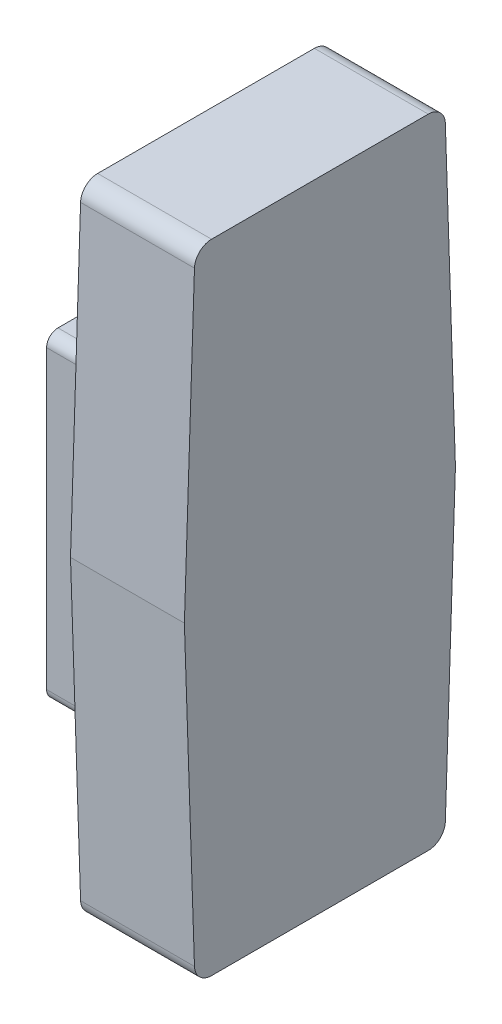
ISO-10303-21;
HEADER;
FILE_DESCRIPTION(('STEP AP214'),'2;1');
FILE_NAME('part.step','',(''),(''),'','','');
FILE_SCHEMA(('AUTOMOTIVE_DESIGN { 1 0 10303 214 1 1 1 1 }'));
ENDSEC;
DATA;
#1=APPLICATION_CONTEXT('core data for automotive mechanical design processes');
#2=APPLICATION_PROTOCOL_DEFINITION('international standard','automotive_design',2000,#1);
#3=PRODUCT_CONTEXT('',#1,'mechanical');
#4=PRODUCT('Part','Part','',(#3));
#5=PRODUCT_RELATED_PRODUCT_CATEGORY('part','',(#4));
#6=PRODUCT_DEFINITION_FORMATION('','',#4);
#7=PRODUCT_DEFINITION_CONTEXT('part definition',#1,'design');
#8=PRODUCT_DEFINITION('design','',#6,#7);
#9=PRODUCT_DEFINITION_SHAPE('','',#8);
#10=(LENGTH_UNIT() NAMED_UNIT(*) SI_UNIT(.MILLI.,.METRE.));
#11=(NAMED_UNIT(*) PLANE_ANGLE_UNIT() SI_UNIT($,.RADIAN.));
#12=(NAMED_UNIT(*) SI_UNIT($,.STERADIAN.) SOLID_ANGLE_UNIT());
#13=UNCERTAINTY_MEASURE_WITH_UNIT(LENGTH_MEASURE(1.E-05),#10,'distance_accuracy_value','');
#14=(GEOMETRIC_REPRESENTATION_CONTEXT(3) GLOBAL_UNCERTAINTY_ASSIGNED_CONTEXT((#13)) GLOBAL_UNIT_ASSIGNED_CONTEXT((#10,
#11,#12)) REPRESENTATION_CONTEXT('',''));
#15=CARTESIAN_POINT('',(0.,0.,0.));
#16=DIRECTION('',(0.,0.,1.));
#17=DIRECTION('',(1.,0.,0.));
#18=AXIS2_PLACEMENT_3D('',#15,#16,#17);
#19=CARTESIAN_POINT('',(0.,-13.462,0.));
#20=DIRECTION('',(1.,0.,0.));
#21=DIRECTION('',(0.,0.,-1.));
#22=AXIS2_PLACEMENT_3D('',#19,#20,#21);
#23=PLANE('',#22);
#24=CARTESIAN_POINT('',(0.,-13.462,0.));
#25=DIRECTION('',(1.,0.,0.));
#26=DIRECTION('',(0.,0.,-1.));
#27=AXIS2_PLACEMENT_3D('',#24,#25,#26);
#28=CIRCLE('',#27,0.381000000000001);
#29=CARTESIAN_POINT('',(0.,-13.843,0.));
#30=VERTEX_POINT('',#29);
#31=CARTESIAN_POINT('',(0.,-13.4746919372469,-0.380788543326764));
#32=VERTEX_POINT('',#31);
#33=EDGE_CURVE('E196',#30,#32,#28,.T.);
#34=ORIENTED_EDGE('',*,*,#33,.F.);
#35=DIRECTION('',(0.,0.,-1.));
#36=VECTOR('',#35,1.);
#37=CARTESIAN_POINT('',(0.,-13.843,4.83351517574958));
#38=LINE('',#37,#36);
#39=CARTESIAN_POINT('',(0.,-13.843,4.83351517574958));
#40=VERTEX_POINT('',#39);
#41=EDGE_CURVE('E212',#40,#30,#38,.T.);
#42=ORIENTED_EDGE('',*,*,#41,.F.);
#43=CARTESIAN_POINT('',(0.,-13.462,4.83351517574958));
#44=DIRECTION('',(1.,0.,0.));
#45=DIRECTION('',(0.,0.,-1.));
#46=AXIS2_PLACEMENT_3D('',#43,#44,#45);
#47=CIRCLE('',#46,0.381);
#48=CARTESIAN_POINT('',(0.,-13.4746919372469,5.21430371907635));
#49=VERTEX_POINT('',#48);
#50=EDGE_CURVE('E246',#49,#40,#47,.T.);
#51=ORIENTED_EDGE('',*,*,#50,.F.);
#52=DIRECTION('',(0.,-0.999444995608313,-0.0333121712516466));
#53=VECTOR('',#52,1.);
#54=CARTESIAN_POINT('',(0.,-6.731,5.43907548907775));
#55=LINE('',#54,#53);
#56=CARTESIAN_POINT('',(0.,-6.731,5.43907548907775));
#57=VERTEX_POINT('',#56);
#58=EDGE_CURVE('E243',#57,#49,#55,.T.);
#59=ORIENTED_EDGE('',*,*,#58,.F.);
#60=DIRECTION('',(0.,-0.999444995608313,0.0333121712516464));
#61=VECTOR('',#60,1.);
#62=CARTESIAN_POINT('',(0.,0.0126919372468769,5.21430371907635));
#63=LINE('',#62,#61);
#64=CARTESIAN_POINT('',(0.,0.0126919372468769,5.21430371907635));
#65=VERTEX_POINT('',#64);
#66=EDGE_CURVE('E241',#65,#57,#63,.T.);
#67=ORIENTED_EDGE('',*,*,#66,.F.);
#68=CARTESIAN_POINT('',(0.,0.,4.83351517574958));
#69=DIRECTION('',(1.,0.,0.));
#70=DIRECTION('',(0.,0.,-1.));
#71=AXIS2_PLACEMENT_3D('',#68,#69,#70);
#72=CIRCLE('',#71,0.381000000000001);
#73=CARTESIAN_POINT('',(0.,0.380999999999999,4.83351517574958));
#74=VERTEX_POINT('',#73);
#75=EDGE_CURVE('E239',#74,#65,#72,.T.);
#76=ORIENTED_EDGE('',*,*,#75,.F.);
#77=DIRECTION('',(0.,0.,1.));
#78=VECTOR('',#77,1.);
#79=CARTESIAN_POINT('',(0.,0.380999999999999,0.));
#80=LINE('',#79,#78);
#81=CARTESIAN_POINT('',(0.,0.381,0.));
#82=VERTEX_POINT('',#81);
#83=EDGE_CURVE('E237',#82,#74,#80,.T.);
#84=ORIENTED_EDGE('',*,*,#83,.F.);
#85=CARTESIAN_POINT('',(0.,0.,0.));
#86=DIRECTION('',(1.,0.,0.));
#87=DIRECTION('',(0.,0.,-1.));
#88=AXIS2_PLACEMENT_3D('',#85,#86,#87);
#89=CIRCLE('',#88,0.381);
#90=CARTESIAN_POINT('',(0.,0.0126919372468778,-0.380788543326767));
#91=VERTEX_POINT('',#90);
#92=EDGE_CURVE('E235',#91,#82,#89,.T.);
#93=ORIENTED_EDGE('',*,*,#92,.F.);
#94=DIRECTION('',(0.,0.999444995608313,0.0333121712516459));
#95=VECTOR('',#94,1.);
#96=CARTESIAN_POINT('',(0.,-6.731,-0.605560313328157));
#97=LINE('',#96,#95);
#98=CARTESIAN_POINT('',(0.,-6.731,-0.605560313328157));
#99=VERTEX_POINT('',#98);
#100=EDGE_CURVE('E233',#99,#91,#97,.T.);
#101=ORIENTED_EDGE('',*,*,#100,.F.);
#102=DIRECTION('',(0.,0.999444995608313,-0.0333121712516464));
#103=VECTOR('',#102,1.);
#104=CARTESIAN_POINT('',(0.,-13.4746919372469,-0.380788543326764));
#105=LINE('',#104,#103);
#106=EDGE_CURVE('E202',#32,#99,#105,.T.);
#107=ORIENTED_EDGE('',*,*,#106,.F.);
#108=EDGE_LOOP('',(#34,#42,#51,#59,#67,#76,#84,#93,#101,#107));
#109=FACE_BOUND('',#108,.T.);
#110=CARTESIAN_POINT('',(0.,-10.033,0.130757587874789));
#111=DIRECTION('',(-1.,0.,0.));
#112=DIRECTION('',(0.,0.,1.));
#113=AXIS2_PLACEMENT_3D('',#110,#111,#112);
#114=CIRCLE('',#113,0.254);
#115=CARTESIAN_POINT('',(0.,-10.033,-0.123242412125212));
#116=VERTEX_POINT('',#115);
#117=CARTESIAN_POINT('',(0.,-10.287,0.130757587874789));
#118=VERTEX_POINT('',#117);
#119=EDGE_CURVE('E194',#116,#118,#114,.T.);
#120=ORIENTED_EDGE('',*,*,#119,.F.);
#121=DIRECTION('',(0.,-1.,0.));
#122=VECTOR('',#121,1.);
#123=CARTESIAN_POINT('',(0.,-10.033,-0.123242412125212));
#124=LINE('',#123,#122);
#125=CARTESIAN_POINT('',(0.,-3.429,-0.123242412125213));
#126=VERTEX_POINT('',#125);
#127=EDGE_CURVE('E191',#126,#116,#124,.T.);
#128=ORIENTED_EDGE('',*,*,#127,.F.);
#129=CARTESIAN_POINT('',(0.,-3.429,0.130757587874788));
#130=DIRECTION('',(-1.,0.,0.));
#131=DIRECTION('',(0.,0.,1.));
#132=AXIS2_PLACEMENT_3D('',#129,#130,#131);
#133=CIRCLE('',#132,0.254000000000001);
#134=CARTESIAN_POINT('',(0.,-3.175,0.130757587874788));
#135=VERTEX_POINT('',#134);
#136=EDGE_CURVE('E593',#135,#126,#133,.T.);
#137=ORIENTED_EDGE('',*,*,#136,.F.);
#138=DIRECTION('',(0.,0.,-1.));
#139=VECTOR('',#138,1.);
#140=CARTESIAN_POINT('',(0.,-3.175,0.130757587874788));
#141=LINE('',#140,#139);
#142=CARTESIAN_POINT('',(0.,-3.175,4.70275758787479));
#143=VERTEX_POINT('',#142);
#144=EDGE_CURVE('E590',#143,#135,#141,.T.);
#145=ORIENTED_EDGE('',*,*,#144,.F.);
#146=CARTESIAN_POINT('',(0.,-3.429,4.70275758787479));
#147=DIRECTION('',(-1.,0.,0.));
#148=DIRECTION('',(0.,0.,-1.));
#149=AXIS2_PLACEMENT_3D('',#146,#147,#148);
#150=CIRCLE('',#149,0.254);
#151=CARTESIAN_POINT('',(0.,-3.429,4.95675758787479));
#152=VERTEX_POINT('',#151);
#153=EDGE_CURVE('E587',#152,#143,#150,.T.);
#154=ORIENTED_EDGE('',*,*,#153,.F.);
#155=DIRECTION('',(0.,1.,0.));
#156=VECTOR('',#155,1.);
#157=CARTESIAN_POINT('',(0.,-10.033,4.95675758787479));
#158=LINE('',#157,#156);
#159=CARTESIAN_POINT('',(0.,-10.033,4.95675758787479));
#160=VERTEX_POINT('',#159);
#161=EDGE_CURVE('E584',#160,#152,#158,.T.);
#162=ORIENTED_EDGE('',*,*,#161,.F.);
#163=CARTESIAN_POINT('',(0.,-10.033,4.70275758787479));
#164=DIRECTION('',(-1.,0.,0.));
#165=DIRECTION('',(0.,0.,1.));
#166=AXIS2_PLACEMENT_3D('',#163,#164,#165);
#167=CIRCLE('',#166,0.254);
#168=CARTESIAN_POINT('',(0.,-10.287,4.70275758787479));
#169=VERTEX_POINT('',#168);
#170=EDGE_CURVE('E62',#169,#160,#167,.T.);
#171=ORIENTED_EDGE('',*,*,#170,.F.);
#172=DIRECTION('',(0.,0.,1.));
#173=VECTOR('',#172,1.);
#174=CARTESIAN_POINT('',(0.,-10.287,0.130757587874789));
#175=LINE('',#174,#173);
#176=EDGE_CURVE('E57',#118,#169,#175,.T.);
#177=ORIENTED_EDGE('',*,*,#176,.F.);
#178=EDGE_LOOP('',(#120,#128,#137,#145,#154,#162,#171,#177));
#179=FACE_BOUND('',#178,.T.);
#180=ADVANCED_FACE('F38',(#109,#179),#23,.F.);
#181=CARTESIAN_POINT('',(2.54,-13.462,0.));
#182=DIRECTION('',(-1.,0.,0.));
#183=DIRECTION('',(0.,0.,1.));
#184=AXIS2_PLACEMENT_3D('',#181,#182,#183);
#185=CYLINDRICAL_SURFACE('',#184,0.381000000000001);
#186=ORIENTED_EDGE('',*,*,#33,.T.);
#187=DIRECTION('',(-1.,0.,0.));
#188=VECTOR('',#187,1.);
#189=CARTESIAN_POINT('',(2.54,-13.4746919372469,-0.380788543326764));
#190=LINE('',#189,#188);
#191=CARTESIAN_POINT('',(2.54,-13.4746919372469,-0.380788543326764));
#192=VERTEX_POINT('',#191);
#193=EDGE_CURVE('E11',#192,#32,#190,.T.);
#194=ORIENTED_EDGE('',*,*,#193,.F.);
#195=CARTESIAN_POINT('',(2.54,-13.462,0.));
#196=DIRECTION('',(1.,0.,0.));
#197=DIRECTION('',(0.,0.,-1.));
#198=AXIS2_PLACEMENT_3D('',#195,#196,#197);
#199=CIRCLE('',#198,0.381000000000001);
#200=CARTESIAN_POINT('',(2.54,-13.843,0.));
#201=VERTEX_POINT('',#200);
#202=EDGE_CURVE('E208',#201,#192,#199,.T.);
#203=ORIENTED_EDGE('',*,*,#202,.F.);
#204=DIRECTION('',(-1.,0.,0.));
#205=VECTOR('',#204,1.);
#206=CARTESIAN_POINT('',(2.54,-13.843,0.));
#207=LINE('',#206,#205);
#208=EDGE_CURVE('E230',#201,#30,#207,.T.);
#209=ORIENTED_EDGE('',*,*,#208,.T.);
#210=EDGE_LOOP('',(#186,#194,#203,#209));
#211=FACE_BOUND('',#210,.T.);
#212=ADVANCED_FACE('F40',(#211),#185,.T.);
#213=CARTESIAN_POINT('',(2.54,-13.4746919372469,-0.380788543326764));
#214=DIRECTION('',(0.,0.0333121712516464,0.999444995608313));
#215=DIRECTION('',(0.,-0.999444995608313,0.0333121712516464));
#216=AXIS2_PLACEMENT_3D('',#213,#214,#215);
#217=PLANE('',#216);
#218=ORIENTED_EDGE('',*,*,#106,.T.);
#219=DIRECTION('',(-1.,0.,0.));
#220=VECTOR('',#219,1.);
#221=CARTESIAN_POINT('',(2.54,-6.731,-0.605560313328157));
#222=LINE('',#221,#220);
#223=CARTESIAN_POINT('',(2.54,-6.731,-0.605560313328157));
#224=VERTEX_POINT('',#223);
#225=EDGE_CURVE('E47',#224,#99,#222,.T.);
#226=ORIENTED_EDGE('',*,*,#225,.F.);
#227=DIRECTION('',(0.,0.999444995608313,-0.0333121712516464));
#228=VECTOR('',#227,1.);
#229=CARTESIAN_POINT('',(2.54,-13.4746919372469,-0.380788543326764));
#230=LINE('',#229,#228);
#231=EDGE_CURVE('E211',#192,#224,#230,.T.);
#232=ORIENTED_EDGE('',*,*,#231,.F.);
#233=ORIENTED_EDGE('',*,*,#193,.T.);
#234=EDGE_LOOP('',(#218,#226,#232,#233));
#235=FACE_BOUND('',#234,.T.);
#236=ADVANCED_FACE('F303',(#235),#217,.F.);
#237=CARTESIAN_POINT('',(2.54,-6.731,-0.605560313328157));
#238=DIRECTION('',(0.,-0.0333121712516459,0.999444995608313));
#239=DIRECTION('',(0.,-0.999444995608313,-0.0333121712516459));
#240=AXIS2_PLACEMENT_3D('',#237,#238,#239);
#241=PLANE('',#240);
#242=ORIENTED_EDGE('',*,*,#100,.T.);
#243=DIRECTION('',(-1.,0.,0.));
#244=VECTOR('',#243,1.);
#245=CARTESIAN_POINT('',(2.54,0.0126919372468778,-0.380788543326767));
#246=LINE('',#245,#244);
#247=CARTESIAN_POINT('',(2.54,0.0126919372468778,-0.380788543326767));
#248=VERTEX_POINT('',#247);
#249=EDGE_CURVE('E274',#248,#91,#246,.T.);
#250=ORIENTED_EDGE('',*,*,#249,.F.);
#251=DIRECTION('',(0.,0.999444995608313,0.0333121712516459));
#252=VECTOR('',#251,1.);
#253=CARTESIAN_POINT('',(2.54,-6.731,-0.605560313328157));
#254=LINE('',#253,#252);
#255=EDGE_CURVE('E215',#224,#248,#254,.T.);
#256=ORIENTED_EDGE('',*,*,#255,.F.);
#257=ORIENTED_EDGE('',*,*,#225,.T.);
#258=EDGE_LOOP('',(#242,#250,#256,#257));
#259=FACE_BOUND('',#258,.T.);
#260=ADVANCED_FACE('F281',(#259),#241,.F.);
#261=CARTESIAN_POINT('',(2.54,0.,0.));
#262=DIRECTION('',(-1.,0.,0.));
#263=DIRECTION('',(0.,0.,1.));
#264=AXIS2_PLACEMENT_3D('',#261,#262,#263);
#265=CYLINDRICAL_SURFACE('',#264,0.381);
#266=ORIENTED_EDGE('',*,*,#92,.T.);
#267=DIRECTION('',(-1.,0.,0.));
#268=VECTOR('',#267,1.);
#269=CARTESIAN_POINT('',(2.54,0.381,0.));
#270=LINE('',#269,#268);
#271=CARTESIAN_POINT('',(2.54,0.381,0.));
#272=VERTEX_POINT('',#271);
#273=EDGE_CURVE('E271',#272,#82,#270,.T.);
#274=ORIENTED_EDGE('',*,*,#273,.F.);
#275=CARTESIAN_POINT('',(2.54,0.,0.));
#276=DIRECTION('',(1.,0.,0.));
#277=DIRECTION('',(0.,0.,-1.));
#278=AXIS2_PLACEMENT_3D('',#275,#276,#277);
#279=CIRCLE('',#278,0.381);
#280=EDGE_CURVE('E217',#248,#272,#279,.T.);
#281=ORIENTED_EDGE('',*,*,#280,.F.);
#282=ORIENTED_EDGE('',*,*,#249,.T.);
#283=EDGE_LOOP('',(#266,#274,#281,#282));
#284=FACE_BOUND('',#283,.T.);
#285=ADVANCED_FACE('F291',(#284),#265,.T.);
#286=CARTESIAN_POINT('',(2.54,0.380999999999999,0.));
#287=DIRECTION('',(0.,-1.,0.));
#288=DIRECTION('',(0.,0.,-1.));
#289=AXIS2_PLACEMENT_3D('',#286,#287,#288);
#290=PLANE('',#289);
#291=ORIENTED_EDGE('',*,*,#83,.T.);
#292=DIRECTION('',(-1.,0.,0.));
#293=VECTOR('',#292,1.);
#294=CARTESIAN_POINT('',(2.54,0.380999999999999,4.83351517574958));
#295=LINE('',#294,#293);
#296=CARTESIAN_POINT('',(2.54,0.380999999999999,4.83351517574958));
#297=VERTEX_POINT('',#296);
#298=EDGE_CURVE('E268',#297,#74,#295,.T.);
#299=ORIENTED_EDGE('',*,*,#298,.F.);
#300=DIRECTION('',(0.,0.,1.));
#301=VECTOR('',#300,1.);
#302=CARTESIAN_POINT('',(2.54,0.380999999999999,0.));
#303=LINE('',#302,#301);
#304=EDGE_CURVE('E219',#272,#297,#303,.T.);
#305=ORIENTED_EDGE('',*,*,#304,.F.);
#306=ORIENTED_EDGE('',*,*,#273,.T.);
#307=EDGE_LOOP('',(#291,#299,#305,#306));
#308=FACE_BOUND('',#307,.T.);
#309=ADVANCED_FACE('F295',(#308),#290,.F.);
#310=CARTESIAN_POINT('',(2.54,0.,4.83351517574958));
#311=DIRECTION('',(-1.,0.,0.));
#312=DIRECTION('',(0.,0.,1.));
#313=AXIS2_PLACEMENT_3D('',#310,#311,#312);
#314=CYLINDRICAL_SURFACE('',#313,0.381000000000001);
#315=ORIENTED_EDGE('',*,*,#75,.T.);
#316=DIRECTION('',(-1.,0.,0.));
#317=VECTOR('',#316,1.);
#318=CARTESIAN_POINT('',(2.54,0.0126919372468769,5.21430371907635));
#319=LINE('',#318,#317);
#320=CARTESIAN_POINT('',(2.54,0.0126919372468769,5.21430371907635));
#321=VERTEX_POINT('',#320);
#322=EDGE_CURVE('E265',#321,#65,#319,.T.);
#323=ORIENTED_EDGE('',*,*,#322,.F.);
#324=CARTESIAN_POINT('',(2.54,0.,4.83351517574958));
#325=DIRECTION('',(1.,0.,0.));
#326=DIRECTION('',(0.,0.,-1.));
#327=AXIS2_PLACEMENT_3D('',#324,#325,#326);
#328=CIRCLE('',#327,0.381000000000001);
#329=EDGE_CURVE('E221',#297,#321,#328,.T.);
#330=ORIENTED_EDGE('',*,*,#329,.F.);
#331=ORIENTED_EDGE('',*,*,#298,.T.);
#332=EDGE_LOOP('',(#315,#323,#330,#331));
#333=FACE_BOUND('',#332,.T.);
#334=ADVANCED_FACE('F326',(#333),#314,.T.);
#335=CARTESIAN_POINT('',(2.54,0.0126919372468769,5.21430371907635));
#336=DIRECTION('',(0.,-0.0333121712516464,-0.999444995608313));
#337=DIRECTION('',(0.,0.999444995608313,-0.0333121712516464));
#338=AXIS2_PLACEMENT_3D('',#335,#336,#337);
#339=PLANE('',#338);
#340=ORIENTED_EDGE('',*,*,#66,.T.);
#341=DIRECTION('',(-1.,0.,0.));
#342=VECTOR('',#341,1.);
#343=CARTESIAN_POINT('',(2.54,-6.731,5.43907548907775));
#344=LINE('',#343,#342);
#345=CARTESIAN_POINT('',(2.54,-6.731,5.43907548907775));
#346=VERTEX_POINT('',#345);
#347=EDGE_CURVE('E262',#346,#57,#344,.T.);
#348=ORIENTED_EDGE('',*,*,#347,.F.);
#349=DIRECTION('',(0.,-0.999444995608313,0.0333121712516464));
#350=VECTOR('',#349,1.);
#351=CARTESIAN_POINT('',(2.54,0.0126919372468769,5.21430371907635));
#352=LINE('',#351,#350);
#353=EDGE_CURVE('E223',#321,#346,#352,.T.);
#354=ORIENTED_EDGE('',*,*,#353,.F.);
#355=ORIENTED_EDGE('',*,*,#322,.T.);
#356=EDGE_LOOP('',(#340,#348,#354,#355));
#357=FACE_BOUND('',#356,.T.);
#358=ADVANCED_FACE('F323',(#357),#339,.F.);
#359=CARTESIAN_POINT('',(2.54,-6.731,5.43907548907775));
#360=DIRECTION('',(0.,0.0333121712516466,-0.999444995608313));
#361=DIRECTION('',(0.,0.999444995608313,0.0333121712516466));
#362=AXIS2_PLACEMENT_3D('',#359,#360,#361);
#363=PLANE('',#362);
#364=ORIENTED_EDGE('',*,*,#58,.T.);
#365=DIRECTION('',(-1.,0.,0.));
#366=VECTOR('',#365,1.);
#367=CARTESIAN_POINT('',(2.54,-13.4746919372469,5.21430371907635));
#368=LINE('',#367,#366);
#369=CARTESIAN_POINT('',(2.54,-13.4746919372469,5.21430371907635));
#370=VERTEX_POINT('',#369);
#371=EDGE_CURVE('E258',#370,#49,#368,.T.);
#372=ORIENTED_EDGE('',*,*,#371,.F.);
#373=DIRECTION('',(0.,-0.999444995608313,-0.0333121712516466));
#374=VECTOR('',#373,1.);
#375=CARTESIAN_POINT('',(2.54,-6.731,5.43907548907775));
#376=LINE('',#375,#374);
#377=EDGE_CURVE('E225',#346,#370,#376,.T.);
#378=ORIENTED_EDGE('',*,*,#377,.F.);
#379=ORIENTED_EDGE('',*,*,#347,.T.);
#380=EDGE_LOOP('',(#364,#372,#378,#379));
#381=FACE_BOUND('',#380,.T.);
#382=ADVANCED_FACE('F319',(#381),#363,.F.);
#383=CARTESIAN_POINT('',(2.54,-13.462,4.83351517574958));
#384=DIRECTION('',(-1.,0.,0.));
#385=DIRECTION('',(0.,0.,1.));
#386=AXIS2_PLACEMENT_3D('',#383,#384,#385);
#387=CYLINDRICAL_SURFACE('',#386,0.381);
#388=ORIENTED_EDGE('',*,*,#50,.T.);
#389=DIRECTION('',(-1.,0.,0.));
#390=VECTOR('',#389,1.);
#391=CARTESIAN_POINT('',(2.54,-13.843,4.83351517574958));
#392=LINE('',#391,#390);
#393=CARTESIAN_POINT('',(2.54,-13.843,4.83351517574958));
#394=VERTEX_POINT('',#393);
#395=EDGE_CURVE('E254',#394,#40,#392,.T.);
#396=ORIENTED_EDGE('',*,*,#395,.F.);
#397=CARTESIAN_POINT('',(2.54,-13.462,4.83351517574958));
#398=DIRECTION('',(1.,0.,0.));
#399=DIRECTION('',(0.,0.,-1.));
#400=AXIS2_PLACEMENT_3D('',#397,#398,#399);
#401=CIRCLE('',#400,0.381);
#402=EDGE_CURVE('E227',#370,#394,#401,.T.);
#403=ORIENTED_EDGE('',*,*,#402,.F.);
#404=ORIENTED_EDGE('',*,*,#371,.T.);
#405=EDGE_LOOP('',(#388,#396,#403,#404));
#406=FACE_BOUND('',#405,.T.);
#407=ADVANCED_FACE('F315',(#406),#387,.T.);
#408=CARTESIAN_POINT('',(2.54,-13.843,4.83351517574958));
#409=DIRECTION('',(0.,1.,0.));
#410=DIRECTION('',(0.,0.,1.));
#411=AXIS2_PLACEMENT_3D('',#408,#409,#410);
#412=PLANE('',#411);
#413=ORIENTED_EDGE('',*,*,#41,.T.);
#414=ORIENTED_EDGE('',*,*,#208,.F.);
#415=DIRECTION('',(0.,0.,-1.));
#416=VECTOR('',#415,1.);
#417=CARTESIAN_POINT('',(2.54,-13.843,4.83351517574958));
#418=LINE('',#417,#416);
#419=EDGE_CURVE('E229',#394,#201,#418,.T.);
#420=ORIENTED_EDGE('',*,*,#419,.F.);
#421=ORIENTED_EDGE('',*,*,#395,.T.);
#422=EDGE_LOOP('',(#413,#414,#420,#421));
#423=FACE_BOUND('',#422,.T.);
#424=ADVANCED_FACE('F310',(#423),#412,.F.);
#425=CARTESIAN_POINT('',(2.54,-13.462,0.));
#426=DIRECTION('',(1.,0.,0.));
#427=DIRECTION('',(0.,0.,-1.));
#428=AXIS2_PLACEMENT_3D('',#425,#426,#427);
#429=PLANE('',#428);
#430=ORIENTED_EDGE('',*,*,#202,.T.);
#431=ORIENTED_EDGE('',*,*,#231,.T.);
#432=ORIENTED_EDGE('',*,*,#255,.T.);
#433=ORIENTED_EDGE('',*,*,#280,.T.);
#434=ORIENTED_EDGE('',*,*,#304,.T.);
#435=ORIENTED_EDGE('',*,*,#329,.T.);
#436=ORIENTED_EDGE('',*,*,#353,.T.);
#437=ORIENTED_EDGE('',*,*,#377,.T.);
#438=ORIENTED_EDGE('',*,*,#402,.T.);
#439=ORIENTED_EDGE('',*,*,#419,.T.);
#440=EDGE_LOOP('',(#430,#431,#432,#433,#434,#435,#436,#437,#438,#439));
#441=FACE_BOUND('',#440,.T.);
#442=ADVANCED_FACE('F299',(#441),#429,.T.);
#443=CARTESIAN_POINT('',(-1.016,-10.033,0.130757587874789));
#444=DIRECTION('',(1.,0.,0.));
#445=DIRECTION('',(0.,0.,-1.));
#446=AXIS2_PLACEMENT_3D('',#443,#444,#445);
#447=CYLINDRICAL_SURFACE('',#446,0.254);
#448=ORIENTED_EDGE('',*,*,#119,.T.);
#449=DIRECTION('',(1.,0.,0.));
#450=VECTOR('',#449,1.);
#451=CARTESIAN_POINT('',(-1.016,-10.287,0.130757587874789));
#452=LINE('',#451,#450);
#453=CARTESIAN_POINT('',(-1.016,-10.287,0.130757587874789));
#454=VERTEX_POINT('',#453);
#455=EDGE_CURVE('E173',#454,#118,#452,.T.);
#456=ORIENTED_EDGE('',*,*,#455,.F.);
#457=CARTESIAN_POINT('',(-1.016,-10.033,0.130757587874789));
#458=DIRECTION('',(-1.,0.,0.));
#459=DIRECTION('',(0.,0.,1.));
#460=AXIS2_PLACEMENT_3D('',#457,#458,#459);
#461=CIRCLE('',#460,0.254);
#462=CARTESIAN_POINT('',(-1.016,-10.033,-0.123242412125212));
#463=VERTEX_POINT('',#462);
#464=EDGE_CURVE('E181',#463,#454,#461,.T.);
#465=ORIENTED_EDGE('',*,*,#464,.F.);
#466=DIRECTION('',(1.,0.,0.));
#467=VECTOR('',#466,1.);
#468=CARTESIAN_POINT('',(-1.016,-10.033,-0.123242412125212));
#469=LINE('',#468,#467);
#470=EDGE_CURVE('E579',#463,#116,#469,.T.);
#471=ORIENTED_EDGE('',*,*,#470,.T.);
#472=EDGE_LOOP('',(#448,#456,#465,#471));
#473=FACE_BOUND('',#472,.T.);
#474=ADVANCED_FACE('F193',(#473),#447,.T.);
#475=CARTESIAN_POINT('',(-1.016,-10.287,0.130757587874789));
#476=DIRECTION('',(0.,1.,0.));
#477=DIRECTION('',(0.,0.,1.));
#478=AXIS2_PLACEMENT_3D('',#475,#476,#477);
#479=PLANE('',#478);
#480=ORIENTED_EDGE('',*,*,#176,.T.);
#481=DIRECTION('',(1.,0.,0.));
#482=VECTOR('',#481,1.);
#483=CARTESIAN_POINT('',(-1.016,-10.287,4.70275758787479));
#484=LINE('',#483,#482);
#485=CARTESIAN_POINT('',(-1.016,-10.287,4.70275758787479));
#486=VERTEX_POINT('',#485);
#487=EDGE_CURVE('E176',#486,#169,#484,.T.);
#488=ORIENTED_EDGE('',*,*,#487,.F.);
#489=DIRECTION('',(0.,0.,1.));
#490=VECTOR('',#489,1.);
#491=CARTESIAN_POINT('',(-1.016,-10.287,0.130757587874789));
#492=LINE('',#491,#490);
#493=EDGE_CURVE('E169',#454,#486,#492,.T.);
#494=ORIENTED_EDGE('',*,*,#493,.F.);
#495=ORIENTED_EDGE('',*,*,#455,.T.);
#496=EDGE_LOOP('',(#480,#488,#494,#495));
#497=FACE_BOUND('',#496,.T.);
#498=ADVANCED_FACE('F171',(#497),#479,.F.);
#499=CARTESIAN_POINT('',(-1.016,-10.033,4.70275758787479));
#500=DIRECTION('',(1.,0.,0.));
#501=DIRECTION('',(0.,0.,-1.));
#502=AXIS2_PLACEMENT_3D('',#499,#500,#501);
#503=CYLINDRICAL_SURFACE('',#502,0.254);
#504=ORIENTED_EDGE('',*,*,#170,.T.);
#505=DIRECTION('',(1.,0.,0.));
#506=VECTOR('',#505,1.);
#507=CARTESIAN_POINT('',(-1.016,-10.033,4.95675758787479));
#508=LINE('',#507,#506);
#509=CARTESIAN_POINT('',(-1.016,-10.033,4.95675758787479));
#510=VERTEX_POINT('',#509);
#511=EDGE_CURVE('E204',#510,#160,#508,.T.);
#512=ORIENTED_EDGE('',*,*,#511,.F.);
#513=CARTESIAN_POINT('',(-1.016,-10.033,4.70275758787479));
#514=DIRECTION('',(-1.,0.,0.));
#515=DIRECTION('',(0.,0.,1.));
#516=AXIS2_PLACEMENT_3D('',#513,#514,#515);
#517=CIRCLE('',#516,0.254);
#518=EDGE_CURVE('E180',#486,#510,#517,.T.);
#519=ORIENTED_EDGE('',*,*,#518,.F.);
#520=ORIENTED_EDGE('',*,*,#487,.T.);
#521=EDGE_LOOP('',(#504,#512,#519,#520));
#522=FACE_BOUND('',#521,.T.);
#523=ADVANCED_FACE('F379',(#522),#503,.T.);
#524=CARTESIAN_POINT('',(-1.016,-10.033,4.95675758787479));
#525=DIRECTION('',(0.,0.,-1.));
#526=DIRECTION('',(-1.,0.,0.));
#527=AXIS2_PLACEMENT_3D('',#524,#525,#526);
#528=PLANE('',#527);
#529=ORIENTED_EDGE('',*,*,#161,.T.);
#530=DIRECTION('',(1.,0.,0.));
#531=VECTOR('',#530,1.);
#532=CARTESIAN_POINT('',(-1.016,-3.429,4.95675758787479));
#533=LINE('',#532,#531);
#534=CARTESIAN_POINT('',(-1.016,-3.429,4.95675758787479));
#535=VERTEX_POINT('',#534);
#536=EDGE_CURVE('E610',#535,#152,#533,.T.);
#537=ORIENTED_EDGE('',*,*,#536,.F.);
#538=DIRECTION('',(0.,1.,0.));
#539=VECTOR('',#538,1.);
#540=CARTESIAN_POINT('',(-1.016,-10.033,4.95675758787479));
#541=LINE('',#540,#539);
#542=EDGE_CURVE('E569',#510,#535,#541,.T.);
#543=ORIENTED_EDGE('',*,*,#542,.F.);
#544=ORIENTED_EDGE('',*,*,#511,.T.);
#545=EDGE_LOOP('',(#529,#537,#543,#544));
#546=FACE_BOUND('',#545,.T.);
#547=ADVANCED_FACE('F386',(#546),#528,.F.);
#548=CARTESIAN_POINT('',(-1.016,-3.429,4.70275758787479));
#549=DIRECTION('',(1.,0.,0.));
#550=DIRECTION('',(0.,0.,-1.));
#551=AXIS2_PLACEMENT_3D('',#548,#549,#550);
#552=CYLINDRICAL_SURFACE('',#551,0.254);
#553=ORIENTED_EDGE('',*,*,#153,.T.);
#554=DIRECTION('',(1.,0.,0.));
#555=VECTOR('',#554,1.);
#556=CARTESIAN_POINT('',(-1.016,-3.175,4.70275758787479));
#557=LINE('',#556,#555);
#558=CARTESIAN_POINT('',(-1.016,-3.175,4.70275758787479));
#559=VERTEX_POINT('',#558);
#560=EDGE_CURVE('E607',#559,#143,#557,.T.);
#561=ORIENTED_EDGE('',*,*,#560,.F.);
#562=CARTESIAN_POINT('',(-1.016,-3.429,4.70275758787479));
#563=DIRECTION('',(-1.,0.,0.));
#564=DIRECTION('',(0.,0.,-1.));
#565=AXIS2_PLACEMENT_3D('',#562,#563,#564);
#566=CIRCLE('',#565,0.254);
#567=EDGE_CURVE('E571',#535,#559,#566,.T.);
#568=ORIENTED_EDGE('',*,*,#567,.F.);
#569=ORIENTED_EDGE('',*,*,#536,.T.);
#570=EDGE_LOOP('',(#553,#561,#568,#569));
#571=FACE_BOUND('',#570,.T.);
#572=ADVANCED_FACE('F394',(#571),#552,.T.);
#573=CARTESIAN_POINT('',(-1.016,-3.175,0.130757587874788));
#574=DIRECTION('',(0.,-1.,0.));
#575=DIRECTION('',(0.,0.,-1.));
#576=AXIS2_PLACEMENT_3D('',#573,#574,#575);
#577=PLANE('',#576);
#578=ORIENTED_EDGE('',*,*,#144,.T.);
#579=DIRECTION('',(1.,0.,0.));
#580=VECTOR('',#579,1.);
#581=CARTESIAN_POINT('',(-1.016,-3.175,0.130757587874788));
#582=LINE('',#581,#580);
#583=CARTESIAN_POINT('',(-1.016,-3.175,0.130757587874788));
#584=VERTEX_POINT('',#583);
#585=EDGE_CURVE('E604',#584,#135,#582,.T.);
#586=ORIENTED_EDGE('',*,*,#585,.F.);
#587=DIRECTION('',(0.,0.,-1.));
#588=VECTOR('',#587,1.);
#589=CARTESIAN_POINT('',(-1.016,-3.175,0.130757587874788));
#590=LINE('',#589,#588);
#591=EDGE_CURVE('E573',#559,#584,#590,.T.);
#592=ORIENTED_EDGE('',*,*,#591,.F.);
#593=ORIENTED_EDGE('',*,*,#560,.T.);
#594=EDGE_LOOP('',(#578,#586,#592,#593));
#595=FACE_BOUND('',#594,.T.);
#596=ADVANCED_FACE('F402',(#595),#577,.F.);
#597=CARTESIAN_POINT('',(-1.016,-3.429,0.130757587874788));
#598=DIRECTION('',(1.,0.,0.));
#599=DIRECTION('',(0.,0.,-1.));
#600=AXIS2_PLACEMENT_3D('',#597,#598,#599);
#601=CYLINDRICAL_SURFACE('',#600,0.254000000000001);
#602=ORIENTED_EDGE('',*,*,#136,.T.);
#603=DIRECTION('',(1.,0.,0.));
#604=VECTOR('',#603,1.);
#605=CARTESIAN_POINT('',(-1.016,-3.429,-0.123242412125213));
#606=LINE('',#605,#604);
#607=CARTESIAN_POINT('',(-1.016,-3.429,-0.123242412125213));
#608=VERTEX_POINT('',#607);
#609=EDGE_CURVE('E601',#608,#126,#606,.T.);
#610=ORIENTED_EDGE('',*,*,#609,.F.);
#611=CARTESIAN_POINT('',(-1.016,-3.429,0.130757587874788));
#612=DIRECTION('',(-1.,0.,0.));
#613=DIRECTION('',(0.,0.,1.));
#614=AXIS2_PLACEMENT_3D('',#611,#612,#613);
#615=CIRCLE('',#614,0.254000000000001);
#616=EDGE_CURVE('E575',#584,#608,#615,.T.);
#617=ORIENTED_EDGE('',*,*,#616,.F.);
#618=ORIENTED_EDGE('',*,*,#585,.T.);
#619=EDGE_LOOP('',(#602,#610,#617,#618));
#620=FACE_BOUND('',#619,.T.);
#621=ADVANCED_FACE('F410',(#620),#601,.T.);
#622=CARTESIAN_POINT('',(-1.016,-10.033,-0.123242412125212));
#623=DIRECTION('',(0.,0.,1.));
#624=DIRECTION('',(0.,-1.,0.));
#625=AXIS2_PLACEMENT_3D('',#622,#623,#624);
#626=PLANE('',#625);
#627=ORIENTED_EDGE('',*,*,#127,.T.);
#628=ORIENTED_EDGE('',*,*,#470,.F.);
#629=DIRECTION('',(0.,-1.,0.));
#630=VECTOR('',#629,1.);
#631=CARTESIAN_POINT('',(-1.016,-10.033,-0.123242412125212));
#632=LINE('',#631,#630);
#633=EDGE_CURVE('E186',#608,#463,#632,.T.);
#634=ORIENTED_EDGE('',*,*,#633,.F.);
#635=ORIENTED_EDGE('',*,*,#609,.T.);
#636=EDGE_LOOP('',(#627,#628,#634,#635));
#637=FACE_BOUND('',#636,.T.);
#638=ADVANCED_FACE('F418',(#637),#626,.F.);
#639=CARTESIAN_POINT('',(-1.016,-10.033,0.130757587874789));
#640=DIRECTION('',(-1.,0.,0.));
#641=DIRECTION('',(0.,0.,1.));
#642=AXIS2_PLACEMENT_3D('',#639,#640,#641);
#643=PLANE('',#642);
#644=CARTESIAN_POINT('',(-1.016,-8.001,2.41675758787479));
#645=DIRECTION('',(-1.,0.,0.));
#646=DIRECTION('',(0.,0.,1.));
#647=AXIS2_PLACEMENT_3D('',#644,#645,#646);
#648=CIRCLE('',#647,0.635);
#649=CARTESIAN_POINT('',(-1.016,-8.001,3.05175758787479));
#650=VERTEX_POINT('',#649);
#651=EDGE_CURVE('E555',#650,#650,#648,.T.);
#652=ORIENTED_EDGE('',*,*,#651,.F.);
#653=EDGE_LOOP('',(#652));
#654=FACE_BOUND('',#653,.T.);
#655=CARTESIAN_POINT('',(-1.016,-5.461,2.41675758787479));
#656=DIRECTION('',(-1.,0.,0.));
#657=DIRECTION('',(0.,0.,1.));
#658=AXIS2_PLACEMENT_3D('',#655,#656,#657);
#659=CIRCLE('',#658,0.635);
#660=CARTESIAN_POINT('',(-1.016,-5.461,3.05175758787479));
#661=VERTEX_POINT('',#660);
#662=EDGE_CURVE('E554',#661,#661,#659,.T.);
#663=ORIENTED_EDGE('',*,*,#662,.F.);
#664=EDGE_LOOP('',(#663));
#665=FACE_BOUND('',#664,.T.);
#666=ORIENTED_EDGE('',*,*,#464,.T.);
#667=ORIENTED_EDGE('',*,*,#493,.T.);
#668=ORIENTED_EDGE('',*,*,#518,.T.);
#669=ORIENTED_EDGE('',*,*,#542,.T.);
#670=ORIENTED_EDGE('',*,*,#567,.T.);
#671=ORIENTED_EDGE('',*,*,#591,.T.);
#672=ORIENTED_EDGE('',*,*,#616,.T.);
#673=ORIENTED_EDGE('',*,*,#633,.T.);
#674=EDGE_LOOP('',(#666,#667,#668,#669,#670,#671,#672,#673));
#675=FACE_BOUND('',#674,.T.);
#676=ADVANCED_FACE('F184',(#654,#665,#675),#643,.T.);
#677=CARTESIAN_POINT('',(1.524,-5.461,2.41675758787479));
#678=DIRECTION('',(-1.,0.,0.));
#679=DIRECTION('',(0.,0.,1.));
#680=AXIS2_PLACEMENT_3D('',#677,#678,#679);
#681=CYLINDRICAL_SURFACE('',#680,0.635);
#682=CARTESIAN_POINT('',(1.524,-5.461,2.41675758787479));
#683=DIRECTION('',(-1.,0.,0.));
#684=DIRECTION('',(0.,0.,1.));
#685=AXIS2_PLACEMENT_3D('',#682,#683,#684);
#686=CIRCLE('',#685,0.635);
#687=CARTESIAN_POINT('',(1.524,-5.461,3.05175758787479));
#688=VERTEX_POINT('',#687);
#689=EDGE_CURVE('E561',#688,#688,#686,.T.);
#690=ORIENTED_EDGE('',*,*,#689,.F.);
#691=EDGE_LOOP('',(#690));
#692=FACE_BOUND('',#691,.T.);
#693=ORIENTED_EDGE('',*,*,#662,.T.);
#694=EDGE_LOOP('',(#693));
#695=FACE_BOUND('',#694,.T.);
#696=ADVANCED_FACE('F433',(#692,#695),#681,.F.);
#697=CARTESIAN_POINT('',(1.524,-5.461,2.41675758787479));
#698=DIRECTION('',(-1.,0.,0.));
#699=DIRECTION('',(0.,0.,1.));
#700=AXIS2_PLACEMENT_3D('',#697,#698,#699);
#701=PLANE('',#700);
#702=ORIENTED_EDGE('',*,*,#689,.T.);
#703=EDGE_LOOP('',(#702));
#704=FACE_BOUND('',#703,.T.);
#705=ADVANCED_FACE('F441',(#704),#701,.T.);
#706=CARTESIAN_POINT('',(1.524,-8.001,2.41675758787479));
#707=DIRECTION('',(-1.,0.,0.));
#708=DIRECTION('',(0.,0.,1.));
#709=AXIS2_PLACEMENT_3D('',#706,#707,#708);
#710=CYLINDRICAL_SURFACE('',#709,0.635);
#711=CARTESIAN_POINT('',(1.524,-8.001,2.41675758787479));
#712=DIRECTION('',(-1.,0.,0.));
#713=DIRECTION('',(0.,0.,1.));
#714=AXIS2_PLACEMENT_3D('',#711,#712,#713);
#715=CIRCLE('',#714,0.635);
#716=CARTESIAN_POINT('',(1.524,-8.001,3.05175758787479));
#717=VERTEX_POINT('',#716);
#718=EDGE_CURVE('E552',#717,#717,#715,.T.);
#719=ORIENTED_EDGE('',*,*,#718,.F.);
#720=EDGE_LOOP('',(#719));
#721=FACE_BOUND('',#720,.T.);
#722=ORIENTED_EDGE('',*,*,#651,.T.);
#723=EDGE_LOOP('',(#722));
#724=FACE_BOUND('',#723,.T.);
#725=ADVANCED_FACE('F449',(#721,#724),#710,.F.);
#726=CARTESIAN_POINT('',(1.524,-8.001,2.41675758787479));
#727=DIRECTION('',(-1.,0.,0.));
#728=DIRECTION('',(0.,0.,1.));
#729=AXIS2_PLACEMENT_3D('',#726,#727,#728);
#730=PLANE('',#729);
#731=ORIENTED_EDGE('',*,*,#718,.T.);
#732=EDGE_LOOP('',(#731));
#733=FACE_BOUND('',#732,.T.);
#734=ADVANCED_FACE('F457',(#733),#730,.T.);
#735=CLOSED_SHELL('',(#180,#212,#236,#260,#285,#309,#334,#358,#382,#407,#424,#442,#474,#498,
#523,#547,#572,#596,#621,#638,#676,#696,#705,#725,#734));
#736=MANIFOLD_SOLID_BREP('B2',#735);
#737=ADVANCED_BREP_SHAPE_REPRESENTATION('',(#18,#736),#14);
#738=SHAPE_DEFINITION_REPRESENTATION(#9,#737);
ENDSEC;
END-ISO-10303-21;
